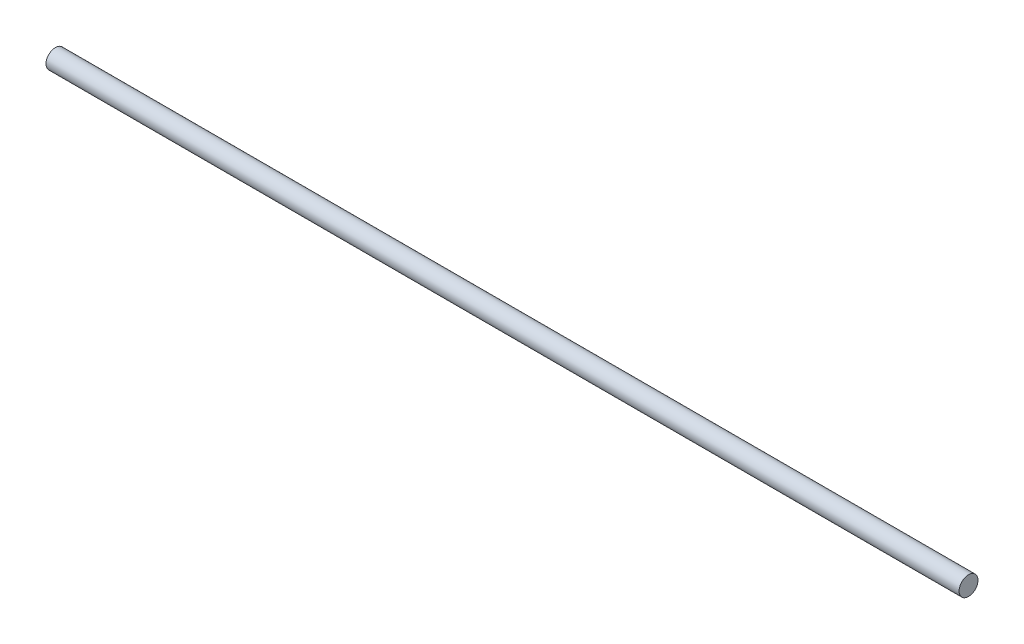
ISO-10303-21;
HEADER;
FILE_DESCRIPTION(('STEP AP214'),'2;1');
FILE_NAME('part.step','',(''),(''),'','','');
FILE_SCHEMA(('AUTOMOTIVE_DESIGN { 1 0 10303 214 1 1 1 1 }'));
ENDSEC;
DATA;
#1=APPLICATION_CONTEXT('core data for automotive mechanical design processes');
#2=APPLICATION_PROTOCOL_DEFINITION('international standard','automotive_design',2000,#1);
#3=PRODUCT_CONTEXT('',#1,'mechanical');
#4=PRODUCT('Part','Part','',(#3));
#5=PRODUCT_RELATED_PRODUCT_CATEGORY('part','',(#4));
#6=PRODUCT_DEFINITION_FORMATION('','',#4);
#7=PRODUCT_DEFINITION_CONTEXT('part definition',#1,'design');
#8=PRODUCT_DEFINITION('design','',#6,#7);
#9=PRODUCT_DEFINITION_SHAPE('','',#8);
#10=(LENGTH_UNIT() NAMED_UNIT(*) SI_UNIT(.MILLI.,.METRE.));
#11=(NAMED_UNIT(*) PLANE_ANGLE_UNIT() SI_UNIT($,.RADIAN.));
#12=(NAMED_UNIT(*) SI_UNIT($,.STERADIAN.) SOLID_ANGLE_UNIT());
#13=UNCERTAINTY_MEASURE_WITH_UNIT(LENGTH_MEASURE(1.E-05),#10,'distance_accuracy_value','');
#14=(GEOMETRIC_REPRESENTATION_CONTEXT(3) GLOBAL_UNCERTAINTY_ASSIGNED_CONTEXT((#13)) GLOBAL_UNIT_ASSIGNED_CONTEXT((#10,
#11,#12)) REPRESENTATION_CONTEXT('',''));
#15=CARTESIAN_POINT('',(0.,0.,0.));
#16=DIRECTION('',(0.,0.,1.));
#17=DIRECTION('',(1.,0.,0.));
#18=AXIS2_PLACEMENT_3D('',#15,#16,#17);
#19=CARTESIAN_POINT('',(290.,0.,0.));
#20=DIRECTION('',(-1.,0.,0.));
#21=DIRECTION('',(0.,0.,1.));
#22=AXIS2_PLACEMENT_3D('',#19,#20,#21);
#23=CYLINDRICAL_SURFACE('',#22,3.);
#24=CARTESIAN_POINT('',(290.,0.,0.));
#25=DIRECTION('',(1.,0.,0.));
#26=DIRECTION('',(0.,0.,-1.));
#27=AXIS2_PLACEMENT_3D('',#24,#25,#26);
#28=CIRCLE('',#27,3.);
#29=CARTESIAN_POINT('',(290.,0.,-3.));
#30=VERTEX_POINT('',#29);
#31=EDGE_CURVE('E10',#30,#30,#28,.T.);
#32=ORIENTED_EDGE('',*,*,#31,.F.);
#33=EDGE_LOOP('',(#32));
#34=FACE_BOUND('',#33,.T.);
#35=CARTESIAN_POINT('',(0.,0.,0.));
#36=DIRECTION('',(1.,0.,0.));
#37=DIRECTION('',(0.,0.,-1.));
#38=AXIS2_PLACEMENT_3D('',#35,#36,#37);
#39=CIRCLE('',#38,3.);
#40=CARTESIAN_POINT('',(0.,0.,-3.));
#41=VERTEX_POINT('',#40);
#42=EDGE_CURVE('E36',#41,#41,#39,.T.);
#43=ORIENTED_EDGE('',*,*,#42,.T.);
#44=EDGE_LOOP('',(#43));
#45=FACE_BOUND('',#44,.T.);
#46=ADVANCED_FACE('F33',(#34,#45),#23,.T.);
#47=CARTESIAN_POINT('',(290.,0.,0.));
#48=DIRECTION('',(1.,0.,0.));
#49=DIRECTION('',(0.,0.,-1.));
#50=AXIS2_PLACEMENT_3D('',#47,#48,#49);
#51=PLANE('',#50);
#52=ORIENTED_EDGE('',*,*,#31,.T.);
#53=EDGE_LOOP('',(#52));
#54=FACE_BOUND('',#53,.T.);
#55=ADVANCED_FACE('F48',(#54),#51,.T.);
#56=CARTESIAN_POINT('',(0.,0.,0.));
#57=DIRECTION('',(1.,0.,0.));
#58=DIRECTION('',(0.,0.,-1.));
#59=AXIS2_PLACEMENT_3D('',#56,#57,#58);
#60=PLANE('',#59);
#61=ORIENTED_EDGE('',*,*,#42,.F.);
#62=EDGE_LOOP('',(#61));
#63=FACE_BOUND('',#62,.T.);
#64=ADVANCED_FACE('F46',(#63),#60,.F.);
#65=CLOSED_SHELL('',(#46,#55,#64));
#66=MANIFOLD_SOLID_BREP('B2',#65);
#67=ADVANCED_BREP_SHAPE_REPRESENTATION('',(#18,#66),#14);
#68=SHAPE_DEFINITION_REPRESENTATION(#9,#67);
ENDSEC;
END-ISO-10303-21;
